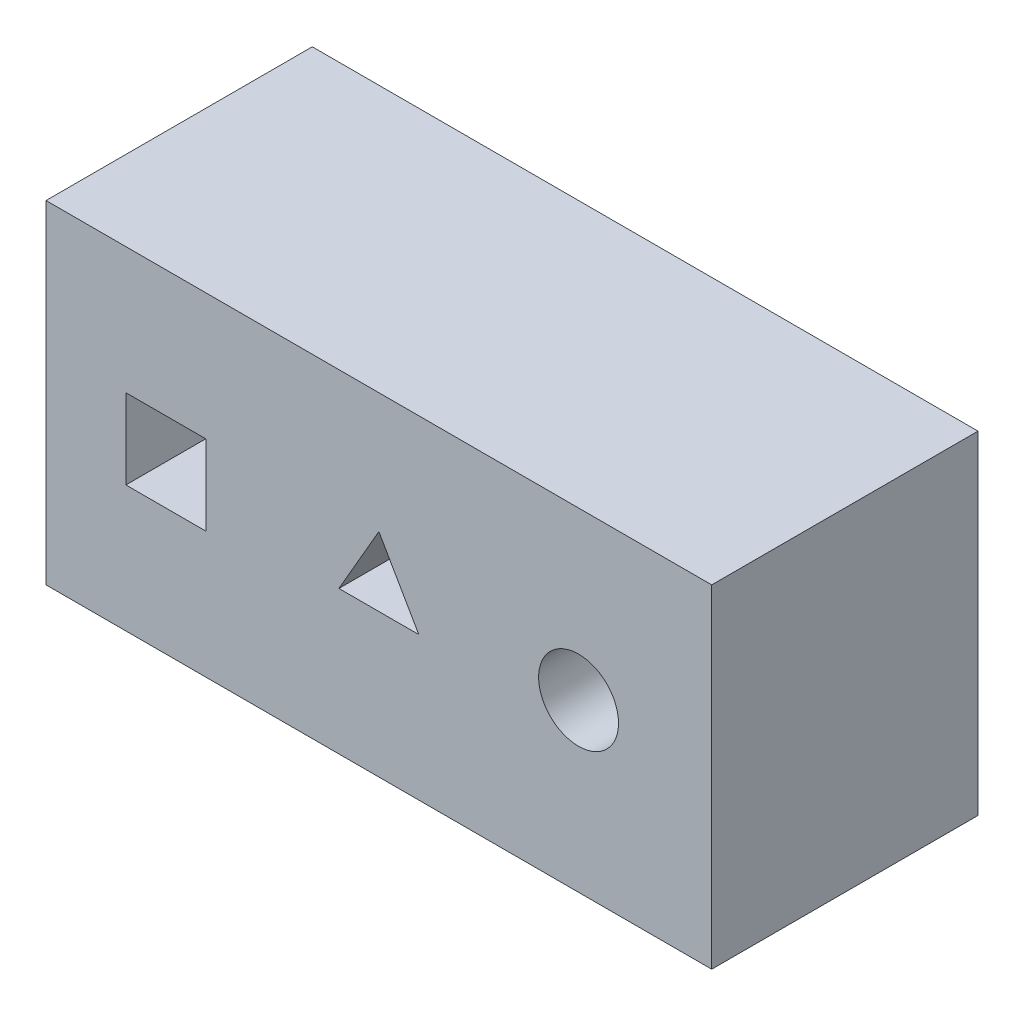
ISO-10303-21;
HEADER;
FILE_DESCRIPTION(('STEP AP214'),'2;1');
FILE_NAME('part.step','',(''),(''),'','','');
FILE_SCHEMA(('AUTOMOTIVE_DESIGN { 1 0 10303 214 1 1 1 1 }'));
ENDSEC;
DATA;
#1=APPLICATION_CONTEXT('core data for automotive mechanical design processes');
#2=APPLICATION_PROTOCOL_DEFINITION('international standard','automotive_design',2000,#1);
#3=PRODUCT_CONTEXT('',#1,'mechanical');
#4=PRODUCT('Part','Part','',(#3));
#5=PRODUCT_RELATED_PRODUCT_CATEGORY('part','',(#4));
#6=PRODUCT_DEFINITION_FORMATION('','',#4);
#7=PRODUCT_DEFINITION_CONTEXT('part definition',#1,'design');
#8=PRODUCT_DEFINITION('design','',#6,#7);
#9=PRODUCT_DEFINITION_SHAPE('','',#8);
#10=(LENGTH_UNIT() NAMED_UNIT(*) SI_UNIT(.MILLI.,.METRE.));
#11=(NAMED_UNIT(*) PLANE_ANGLE_UNIT() SI_UNIT($,.RADIAN.));
#12=(NAMED_UNIT(*) SI_UNIT($,.STERADIAN.) SOLID_ANGLE_UNIT());
#13=UNCERTAINTY_MEASURE_WITH_UNIT(LENGTH_MEASURE(1.E-05),#10,'distance_accuracy_value','');
#14=(GEOMETRIC_REPRESENTATION_CONTEXT(3) GLOBAL_UNCERTAINTY_ASSIGNED_CONTEXT((#13)) GLOBAL_UNIT_ASSIGNED_CONTEXT((#10,
#11,#12)) REPRESENTATION_CONTEXT('',''));
#15=CARTESIAN_POINT('',(0.,0.,0.));
#16=DIRECTION('',(0.,0.,1.));
#17=DIRECTION('',(1.,0.,0.));
#18=AXIS2_PLACEMENT_3D('',#15,#16,#17);
#19=CARTESIAN_POINT('',(0.,0.,100.));
#20=DIRECTION('',(0.,0.,1.));
#21=DIRECTION('',(1.,0.,0.));
#22=AXIS2_PLACEMENT_3D('',#19,#20,#21);
#23=PLANE('',#22);
#24=DIRECTION('',(0.,-1.,0.));
#25=VECTOR('',#24,1.);
#26=CARTESIAN_POINT('',(-125.,-62.5,100.));
#27=LINE('',#26,#25);
#28=CARTESIAN_POINT('',(-125.,62.5,100.));
#29=VERTEX_POINT('',#28);
#30=CARTESIAN_POINT('',(-125.,-62.5,100.));
#31=VERTEX_POINT('',#30);
#32=EDGE_CURVE('E204',#29,#31,#27,.T.);
#33=ORIENTED_EDGE('',*,*,#32,.T.);
#34=DIRECTION('',(1.,0.,0.));
#35=VECTOR('',#34,1.);
#36=CARTESIAN_POINT('',(125.,-62.5,100.));
#37=LINE('',#36,#35);
#38=CARTESIAN_POINT('',(125.,-62.5,100.));
#39=VERTEX_POINT('',#38);
#40=EDGE_CURVE('E92',#31,#39,#37,.T.);
#41=ORIENTED_EDGE('',*,*,#40,.T.);
#42=DIRECTION('',(0.,1.,0.));
#43=VECTOR('',#42,1.);
#44=CARTESIAN_POINT('',(125.,-62.5,100.));
#45=LINE('',#44,#43);
#46=CARTESIAN_POINT('',(125.,62.5,100.));
#47=VERTEX_POINT('',#46);
#48=EDGE_CURVE('E209',#39,#47,#45,.T.);
#49=ORIENTED_EDGE('',*,*,#48,.T.);
#50=DIRECTION('',(-1.,0.,0.));
#51=VECTOR('',#50,1.);
#52=CARTESIAN_POINT('',(125.,62.5,100.));
#53=LINE('',#52,#51);
#54=EDGE_CURVE('E61',#47,#29,#53,.T.);
#55=ORIENTED_EDGE('',*,*,#54,.T.);
#56=EDGE_LOOP('',(#33,#41,#49,#55));
#57=FACE_BOUND('',#56,.T.);
#58=CARTESIAN_POINT('',(74.9999999999999,0.,100.));
#59=DIRECTION('',(0.,0.,1.));
#60=DIRECTION('',(1.,0.,0.));
#61=AXIS2_PLACEMENT_3D('',#58,#59,#60);
#62=CIRCLE('',#61,15.);
#63=CARTESIAN_POINT('',(89.9999999999999,0.,100.));
#64=VERTEX_POINT('',#63);
#65=EDGE_CURVE('E305',#64,#64,#62,.T.);
#66=ORIENTED_EDGE('',*,*,#65,.F.);
#67=EDGE_LOOP('',(#66));
#68=FACE_BOUND('',#67,.T.);
#69=DIRECTION('',(1.,0.,0.));
#70=VECTOR('',#69,1.);
#71=CARTESIAN_POINT('',(0.,15.,100.));
#72=LINE('',#71,#70);
#73=CARTESIAN_POINT('',(-95.,15.,100.));
#74=VERTEX_POINT('',#73);
#75=CARTESIAN_POINT('',(-65.,15.,100.));
#76=VERTEX_POINT('',#75);
#77=EDGE_CURVE('E293',#74,#76,#72,.T.);
#78=ORIENTED_EDGE('',*,*,#77,.T.);
#79=DIRECTION('',(0.,-1.,0.));
#80=VECTOR('',#79,1.);
#81=CARTESIAN_POINT('',(-65.,0.,100.));
#82=LINE('',#81,#80);
#83=CARTESIAN_POINT('',(-65.,-15.,100.));
#84=VERTEX_POINT('',#83);
#85=EDGE_CURVE('E289',#76,#84,#82,.T.);
#86=ORIENTED_EDGE('',*,*,#85,.T.);
#87=DIRECTION('',(1.,0.,0.));
#88=VECTOR('',#87,1.);
#89=CARTESIAN_POINT('',(0.,-15.,100.));
#90=LINE('',#89,#88);
#91=CARTESIAN_POINT('',(-95.,-15.,100.));
#92=VERTEX_POINT('',#91);
#93=EDGE_CURVE('E177',#92,#84,#90,.T.);
#94=ORIENTED_EDGE('',*,*,#93,.F.);
#95=DIRECTION('',(0.,-1.,0.));
#96=VECTOR('',#95,1.);
#97=CARTESIAN_POINT('',(-95.,0.,100.));
#98=LINE('',#97,#96);
#99=EDGE_CURVE('E182',#74,#92,#98,.T.);
#100=ORIENTED_EDGE('',*,*,#99,.F.);
#101=EDGE_LOOP('',(#78,#86,#94,#100));
#102=FACE_BOUND('',#101,.T.);
#103=DIRECTION('',(0.5,-0.866025403784439,0.));
#104=VECTOR('',#103,1.);
#105=CARTESIAN_POINT('',(7.5,4.3301270189222,100.));
#106=LINE('',#105,#104);
#107=CARTESIAN_POINT('',(0.,17.3205080756888,100.));
#108=VERTEX_POINT('',#107);
#109=CARTESIAN_POINT('',(15.,-8.66025403784438,100.));
#110=VERTEX_POINT('',#109);
#111=EDGE_CURVE('E160',#108,#110,#106,.T.);
#112=ORIENTED_EDGE('',*,*,#111,.T.);
#113=DIRECTION('',(-1.,0.,0.));
#114=VECTOR('',#113,1.);
#115=CARTESIAN_POINT('',(0.,-8.66025403784438,100.));
#116=LINE('',#115,#114);
#117=CARTESIAN_POINT('',(-15.,-8.66025403784438,100.));
#118=VERTEX_POINT('',#117);
#119=EDGE_CURVE('E284',#110,#118,#116,.T.);
#120=ORIENTED_EDGE('',*,*,#119,.T.);
#121=DIRECTION('',(0.5,0.866025403784439,0.));
#122=VECTOR('',#121,1.);
#123=CARTESIAN_POINT('',(-7.5,4.33012701892219,100.));
#124=LINE('',#123,#122);
#125=EDGE_CURVE('E148',#118,#108,#124,.T.);
#126=ORIENTED_EDGE('',*,*,#125,.T.);
#127=EDGE_LOOP('',(#112,#120,#126));
#128=FACE_BOUND('',#127,.T.);
#129=ADVANCED_FACE('F43',(#57,#68,#102,#128),#23,.T.);
#130=CARTESIAN_POINT('',(0.,0.,0.));
#131=DIRECTION('',(0.,0.,1.));
#132=DIRECTION('',(1.,0.,0.));
#133=AXIS2_PLACEMENT_3D('',#130,#131,#132);
#134=PLANE('',#133);
#135=DIRECTION('',(0.,-1.,0.));
#136=VECTOR('',#135,1.);
#137=CARTESIAN_POINT('',(-125.,-62.5,0.));
#138=LINE('',#137,#136);
#139=CARTESIAN_POINT('',(-125.,62.5,0.));
#140=VERTEX_POINT('',#139);
#141=CARTESIAN_POINT('',(-125.,-62.5,0.));
#142=VERTEX_POINT('',#141);
#143=EDGE_CURVE('E203',#140,#142,#138,.T.);
#144=ORIENTED_EDGE('',*,*,#143,.F.);
#145=DIRECTION('',(-1.,0.,0.));
#146=VECTOR('',#145,1.);
#147=CARTESIAN_POINT('',(125.,62.5,0.));
#148=LINE('',#147,#146);
#149=CARTESIAN_POINT('',(125.,62.5,0.));
#150=VERTEX_POINT('',#149);
#151=EDGE_CURVE('E85',#150,#140,#148,.T.);
#152=ORIENTED_EDGE('',*,*,#151,.F.);
#153=DIRECTION('',(0.,1.,0.));
#154=VECTOR('',#153,1.);
#155=CARTESIAN_POINT('',(125.,-62.5,0.));
#156=LINE('',#155,#154);
#157=CARTESIAN_POINT('',(125.,-62.5,0.));
#158=VERTEX_POINT('',#157);
#159=EDGE_CURVE('E79',#158,#150,#156,.T.);
#160=ORIENTED_EDGE('',*,*,#159,.F.);
#161=DIRECTION('',(1.,0.,0.));
#162=VECTOR('',#161,1.);
#163=CARTESIAN_POINT('',(125.,-62.5,0.));
#164=LINE('',#163,#162);
#165=EDGE_CURVE('E218',#142,#158,#164,.T.);
#166=ORIENTED_EDGE('',*,*,#165,.F.);
#167=EDGE_LOOP('',(#144,#152,#160,#166));
#168=FACE_BOUND('',#167,.T.);
#169=DIRECTION('',(-0.5,0.866025403784439,0.));
#170=VECTOR('',#169,1.);
#171=CARTESIAN_POINT('',(7.5,4.3301270189222,0.));
#172=LINE('',#171,#170);
#173=CARTESIAN_POINT('',(15.,-8.66025403784438,0.));
#174=VERTEX_POINT('',#173);
#175=CARTESIAN_POINT('',(0.,17.3205080756888,0.));
#176=VERTEX_POINT('',#175);
#177=EDGE_CURVE('E136',#174,#176,#172,.T.);
#178=ORIENTED_EDGE('',*,*,#177,.T.);
#179=DIRECTION('',(-0.5,-0.866025403784439,0.));
#180=VECTOR('',#179,1.);
#181=CARTESIAN_POINT('',(-7.5,4.33012701892219,0.));
#182=LINE('',#181,#180);
#183=CARTESIAN_POINT('',(-15.,-8.66025403784438,-1.11022302462516E-13));
#184=VERTEX_POINT('',#183);
#185=EDGE_CURVE('E140',#176,#184,#182,.T.);
#186=ORIENTED_EDGE('',*,*,#185,.T.);
#187=DIRECTION('',(1.,0.,0.));
#188=VECTOR('',#187,1.);
#189=CARTESIAN_POINT('',(0.,-8.66025403784438,0.));
#190=LINE('',#189,#188);
#191=EDGE_CURVE('E143',#184,#174,#190,.T.);
#192=ORIENTED_EDGE('',*,*,#191,.T.);
#193=EDGE_LOOP('',(#178,#186,#192));
#194=FACE_BOUND('',#193,.T.);
#195=DIRECTION('',(-1.,0.,0.));
#196=VECTOR('',#195,1.);
#197=CARTESIAN_POINT('',(0.,15.,0.));
#198=LINE('',#197,#196);
#199=CARTESIAN_POINT('',(-65.,15.,0.));
#200=VERTEX_POINT('',#199);
#201=CARTESIAN_POINT('',(-95.,15.,0.));
#202=VERTEX_POINT('',#201);
#203=EDGE_CURVE('E191',#200,#202,#198,.T.);
#204=ORIENTED_EDGE('',*,*,#203,.T.);
#205=DIRECTION('',(0.,1.,0.));
#206=VECTOR('',#205,1.);
#207=CARTESIAN_POINT('',(-95.,0.,0.));
#208=LINE('',#207,#206);
#209=CARTESIAN_POINT('',(-95.,-15.,0.));
#210=VERTEX_POINT('',#209);
#211=EDGE_CURVE('E168',#210,#202,#208,.T.);
#212=ORIENTED_EDGE('',*,*,#211,.F.);
#213=DIRECTION('',(-1.,0.,0.));
#214=VECTOR('',#213,1.);
#215=CARTESIAN_POINT('',(0.,-15.,0.));
#216=LINE('',#215,#214);
#217=CARTESIAN_POINT('',(-65.,-15.,-1.11022302462516E-13));
#218=VERTEX_POINT('',#217);
#219=EDGE_CURVE('E186',#218,#210,#216,.T.);
#220=ORIENTED_EDGE('',*,*,#219,.F.);
#221=DIRECTION('',(0.,1.,0.));
#222=VECTOR('',#221,1.);
#223=CARTESIAN_POINT('',(-65.,0.,0.));
#224=LINE('',#223,#222);
#225=EDGE_CURVE('E194',#218,#200,#224,.T.);
#226=ORIENTED_EDGE('',*,*,#225,.T.);
#227=EDGE_LOOP('',(#204,#212,#220,#226));
#228=FACE_BOUND('',#227,.T.);
#229=CARTESIAN_POINT('',(74.9999999999999,0.,0.));
#230=DIRECTION('',(0.,0.,1.));
#231=DIRECTION('',(1.,0.,0.));
#232=AXIS2_PLACEMENT_3D('',#229,#230,#231);
#233=CIRCLE('',#232,15.);
#234=CARTESIAN_POINT('',(89.9999999999999,0.,0.));
#235=VERTEX_POINT('',#234);
#236=EDGE_CURVE('E173',#235,#235,#233,.F.);
#237=ORIENTED_EDGE('',*,*,#236,.F.);
#238=EDGE_LOOP('',(#237));
#239=FACE_BOUND('',#238,.T.);
#240=ADVANCED_FACE('F138',(#168,#194,#228,#239),#134,.F.);
#241=CARTESIAN_POINT('',(-125.,-62.5,100.));
#242=DIRECTION('',(1.,0.,0.));
#243=DIRECTION('',(0.,0.,-1.));
#244=AXIS2_PLACEMENT_3D('',#241,#242,#243);
#245=PLANE('',#244);
#246=ORIENTED_EDGE('',*,*,#143,.T.);
#247=DIRECTION('',(0.,0.,-1.));
#248=VECTOR('',#247,1.);
#249=CARTESIAN_POINT('',(-125.,-62.5,100.));
#250=LINE('',#249,#248);
#251=EDGE_CURVE('E11',#31,#142,#250,.T.);
#252=ORIENTED_EDGE('',*,*,#251,.F.);
#253=ORIENTED_EDGE('',*,*,#32,.F.);
#254=DIRECTION('',(0.,0.,-1.));
#255=VECTOR('',#254,1.);
#256=CARTESIAN_POINT('',(-125.,62.5,100.));
#257=LINE('',#256,#255);
#258=EDGE_CURVE('E214',#29,#140,#257,.T.);
#259=ORIENTED_EDGE('',*,*,#258,.T.);
#260=EDGE_LOOP('',(#246,#252,#253,#259));
#261=FACE_BOUND('',#260,.T.);
#262=ADVANCED_FACE('F45',(#261),#245,.F.);
#263=CARTESIAN_POINT('',(125.,-62.5,100.));
#264=DIRECTION('',(0.,1.,0.));
#265=DIRECTION('',(-1.,0.,0.));
#266=AXIS2_PLACEMENT_3D('',#263,#264,#265);
#267=PLANE('',#266);
#268=ORIENTED_EDGE('',*,*,#165,.T.);
#269=DIRECTION('',(0.,0.,-1.));
#270=VECTOR('',#269,1.);
#271=CARTESIAN_POINT('',(125.,-62.5,100.));
#272=LINE('',#271,#270);
#273=EDGE_CURVE('E53',#39,#158,#272,.T.);
#274=ORIENTED_EDGE('',*,*,#273,.F.);
#275=ORIENTED_EDGE('',*,*,#40,.F.);
#276=ORIENTED_EDGE('',*,*,#251,.T.);
#277=EDGE_LOOP('',(#268,#274,#275,#276));
#278=FACE_BOUND('',#277,.T.);
#279=ADVANCED_FACE('F245',(#278),#267,.F.);
#280=CARTESIAN_POINT('',(125.,-62.5,100.));
#281=DIRECTION('',(-1.,0.,0.));
#282=DIRECTION('',(0.,0.,1.));
#283=AXIS2_PLACEMENT_3D('',#280,#281,#282);
#284=PLANE('',#283);
#285=ORIENTED_EDGE('',*,*,#159,.T.);
#286=DIRECTION('',(0.,0.,-1.));
#287=VECTOR('',#286,1.);
#288=CARTESIAN_POINT('',(125.,62.5,100.));
#289=LINE('',#288,#287);
#290=EDGE_CURVE('E227',#47,#150,#289,.T.);
#291=ORIENTED_EDGE('',*,*,#290,.F.);
#292=ORIENTED_EDGE('',*,*,#48,.F.);
#293=ORIENTED_EDGE('',*,*,#273,.T.);
#294=EDGE_LOOP('',(#285,#291,#292,#293));
#295=FACE_BOUND('',#294,.T.);
#296=ADVANCED_FACE('F231',(#295),#284,.F.);
#297=CARTESIAN_POINT('',(125.,62.5,100.));
#298=DIRECTION('',(0.,-1.,0.));
#299=DIRECTION('',(1.,0.,0.));
#300=AXIS2_PLACEMENT_3D('',#297,#298,#299);
#301=PLANE('',#300);
#302=ORIENTED_EDGE('',*,*,#151,.T.);
#303=ORIENTED_EDGE('',*,*,#258,.F.);
#304=ORIENTED_EDGE('',*,*,#54,.F.);
#305=ORIENTED_EDGE('',*,*,#290,.T.);
#306=EDGE_LOOP('',(#302,#303,#304,#305));
#307=FACE_BOUND('',#306,.T.);
#308=ADVANCED_FACE('F237',(#307),#301,.F.);
#309=CARTESIAN_POINT('',(7.5,4.3301270189222,-279.508497187474));
#310=DIRECTION('',(-0.866025403784439,-0.5,0.));
#311=DIRECTION('',(0.5,-0.866025403784439,0.));
#312=AXIS2_PLACEMENT_3D('',#309,#310,#311);
#313=PLANE('',#312);
#314=ORIENTED_EDGE('',*,*,#177,.F.);
#315=DIRECTION('',(0.,0.,1.));
#316=VECTOR('',#315,1.);
#317=CARTESIAN_POINT('',(15.,-8.66025403784438,-279.508497187474));
#318=LINE('',#317,#316);
#319=EDGE_CURVE('E164',#174,#110,#318,.T.);
#320=ORIENTED_EDGE('',*,*,#319,.T.);
#321=ORIENTED_EDGE('',*,*,#111,.F.);
#322=DIRECTION('',(0.,0.,1.));
#323=VECTOR('',#322,1.);
#324=CARTESIAN_POINT('',(0.,17.3205080756888,-279.508497187474));
#325=LINE('',#324,#323);
#326=EDGE_CURVE('E153',#176,#108,#325,.T.);
#327=ORIENTED_EDGE('',*,*,#326,.F.);
#328=EDGE_LOOP('',(#314,#320,#321,#327));
#329=FACE_BOUND('',#328,.T.);
#330=ADVANCED_FACE('F158',(#329),#313,.T.);
#331=CARTESIAN_POINT('',(-7.5,4.33012701892219,-279.508497187474));
#332=DIRECTION('',(0.866025403784439,-0.5,0.));
#333=DIRECTION('',(0.5,0.866025403784439,0.));
#334=AXIS2_PLACEMENT_3D('',#331,#332,#333);
#335=PLANE('',#334);
#336=ORIENTED_EDGE('',*,*,#185,.F.);
#337=ORIENTED_EDGE('',*,*,#326,.T.);
#338=ORIENTED_EDGE('',*,*,#125,.F.);
#339=DIRECTION('',(0.,0.,1.));
#340=VECTOR('',#339,1.);
#341=CARTESIAN_POINT('',(-15.,-8.66025403784438,-279.508497187474));
#342=LINE('',#341,#340);
#343=EDGE_CURVE('E155',#184,#118,#342,.T.);
#344=ORIENTED_EDGE('',*,*,#343,.F.);
#345=EDGE_LOOP('',(#336,#337,#338,#344));
#346=FACE_BOUND('',#345,.T.);
#347=ADVANCED_FACE('F151',(#346),#335,.T.);
#348=CARTESIAN_POINT('',(0.,15.,-279.508497187474));
#349=DIRECTION('',(0.,-1.,0.));
#350=DIRECTION('',(0.,0.,-1.));
#351=AXIS2_PLACEMENT_3D('',#348,#349,#350);
#352=PLANE('',#351);
#353=ORIENTED_EDGE('',*,*,#203,.F.);
#354=DIRECTION('',(0.,0.,1.));
#355=VECTOR('',#354,1.);
#356=CARTESIAN_POINT('',(-65.,15.,-279.508497187474));
#357=LINE('',#356,#355);
#358=EDGE_CURVE('E163',#200,#76,#357,.T.);
#359=ORIENTED_EDGE('',*,*,#358,.T.);
#360=ORIENTED_EDGE('',*,*,#77,.F.);
#361=DIRECTION('',(0.,0.,1.));
#362=VECTOR('',#361,1.);
#363=CARTESIAN_POINT('',(-95.,15.,-279.508497187474));
#364=LINE('',#363,#362);
#365=EDGE_CURVE('E179',#202,#74,#364,.T.);
#366=ORIENTED_EDGE('',*,*,#365,.F.);
#367=EDGE_LOOP('',(#353,#359,#360,#366));
#368=FACE_BOUND('',#367,.T.);
#369=ADVANCED_FACE('F260',(#368),#352,.T.);
#370=CARTESIAN_POINT('',(-95.,0.,-279.508497187474));
#371=DIRECTION('',(-1.,0.,0.));
#372=DIRECTION('',(0.,0.,1.));
#373=AXIS2_PLACEMENT_3D('',#370,#371,#372);
#374=PLANE('',#373);
#375=DIRECTION('',(0.,0.,1.));
#376=VECTOR('',#375,1.);
#377=CARTESIAN_POINT('',(-95.,-15.,-279.508497187474));
#378=LINE('',#377,#376);
#379=EDGE_CURVE('E183',#210,#92,#378,.T.);
#380=ORIENTED_EDGE('',*,*,#379,.F.);
#381=ORIENTED_EDGE('',*,*,#211,.T.);
#382=ORIENTED_EDGE('',*,*,#365,.T.);
#383=ORIENTED_EDGE('',*,*,#99,.T.);
#384=EDGE_LOOP('',(#380,#381,#382,#383));
#385=FACE_BOUND('',#384,.T.);
#386=ADVANCED_FACE('F263',(#385),#374,.F.);
#387=CARTESIAN_POINT('',(0.,-15.,-279.508497187474));
#388=DIRECTION('',(0.,-1.,0.));
#389=DIRECTION('',(0.,0.,-1.));
#390=AXIS2_PLACEMENT_3D('',#387,#388,#389);
#391=PLANE('',#390);
#392=DIRECTION('',(0.,0.,1.));
#393=VECTOR('',#392,1.);
#394=CARTESIAN_POINT('',(-65.,-15.,-279.508497187474));
#395=LINE('',#394,#393);
#396=EDGE_CURVE('E176',#218,#84,#395,.T.);
#397=ORIENTED_EDGE('',*,*,#396,.F.);
#398=ORIENTED_EDGE('',*,*,#219,.T.);
#399=ORIENTED_EDGE('',*,*,#379,.T.);
#400=ORIENTED_EDGE('',*,*,#93,.T.);
#401=EDGE_LOOP('',(#397,#398,#399,#400));
#402=FACE_BOUND('',#401,.T.);
#403=ADVANCED_FACE('F267',(#402),#391,.F.);
#404=CARTESIAN_POINT('',(0.,-8.66025403784438,-279.508497187474));
#405=DIRECTION('',(0.,1.,0.));
#406=DIRECTION('',(-1.,0.,0.));
#407=AXIS2_PLACEMENT_3D('',#404,#405,#406);
#408=PLANE('',#407);
#409=ORIENTED_EDGE('',*,*,#191,.F.);
#410=ORIENTED_EDGE('',*,*,#343,.T.);
#411=ORIENTED_EDGE('',*,*,#119,.F.);
#412=ORIENTED_EDGE('',*,*,#319,.F.);
#413=EDGE_LOOP('',(#409,#410,#411,#412));
#414=FACE_BOUND('',#413,.T.);
#415=ADVANCED_FACE('F271',(#414),#408,.T.);
#416=CARTESIAN_POINT('',(-65.,0.,-279.508497187474));
#417=DIRECTION('',(-1.,0.,0.));
#418=DIRECTION('',(0.,0.,1.));
#419=AXIS2_PLACEMENT_3D('',#416,#417,#418);
#420=PLANE('',#419);
#421=ORIENTED_EDGE('',*,*,#225,.F.);
#422=ORIENTED_EDGE('',*,*,#396,.T.);
#423=ORIENTED_EDGE('',*,*,#85,.F.);
#424=ORIENTED_EDGE('',*,*,#358,.F.);
#425=EDGE_LOOP('',(#421,#422,#423,#424));
#426=FACE_BOUND('',#425,.T.);
#427=ADVANCED_FACE('F258',(#426),#420,.T.);
#428=CARTESIAN_POINT('',(74.9999999999999,0.,-279.508497187474));
#429=DIRECTION('',(0.,0.,1.));
#430=DIRECTION('',(1.,0.,0.));
#431=AXIS2_PLACEMENT_3D('',#428,#429,#430);
#432=CYLINDRICAL_SURFACE('',#431,15.);
#433=CARTESIAN_POINT('',(89.9999999999999,0.,0.));
#434=CARTESIAN_POINT('',(89.9999999999999,0.,1.04166666666661));
#435=CARTESIAN_POINT('',(89.9999999999999,0.,2.08333333333327));
#436=CARTESIAN_POINT('',(89.9999999999999,0.,4.1666666666666));
#437=CARTESIAN_POINT('',(89.9999999999999,0.,5.20833333333326));
#438=CARTESIAN_POINT('',(89.9999999999999,0.,7.2916666666666));
#439=CARTESIAN_POINT('',(89.9999999999999,0.,8.33333333333329));
#440=CARTESIAN_POINT('',(89.9999999999999,0.,10.4166666666666));
#441=CARTESIAN_POINT('',(89.9999999999999,0.,11.4583333333333));
#442=CARTESIAN_POINT('',(89.9999999999999,0.,13.5416666666666));
#443=CARTESIAN_POINT('',(89.9999999999999,0.,14.5833333333333));
#444=CARTESIAN_POINT('',(89.9999999999999,0.,16.6666666666666));
#445=CARTESIAN_POINT('',(89.9999999999999,0.,17.7083333333333));
#446=CARTESIAN_POINT('',(89.9999999999999,0.,19.7916666666667));
#447=CARTESIAN_POINT('',(89.9999999999999,0.,20.8333333333333));
#448=CARTESIAN_POINT('',(89.9999999999999,0.,22.9166666666666));
#449=CARTESIAN_POINT('',(89.9999999999999,0.,23.9583333333333));
#450=CARTESIAN_POINT('',(89.9999999999999,0.,26.0416666666666));
#451=CARTESIAN_POINT('',(89.9999999999999,0.,27.0833333333333));
#452=CARTESIAN_POINT('',(89.9999999999999,0.,29.1666666666666));
#453=CARTESIAN_POINT('',(89.9999999999999,0.,30.2083333333333));
#454=CARTESIAN_POINT('',(89.9999999999999,0.,32.2916666666666));
#455=CARTESIAN_POINT('',(89.9999999999999,0.,33.3333333333333));
#456=CARTESIAN_POINT('',(89.9999999999999,0.,35.4166666666667));
#457=CARTESIAN_POINT('',(89.9999999999999,0.,36.4583333333333));
#458=CARTESIAN_POINT('',(89.9999999999999,0.,38.5416666666666));
#459=CARTESIAN_POINT('',(89.9999999999999,0.,39.5833333333333));
#460=CARTESIAN_POINT('',(89.9999999999999,0.,41.6666666666667));
#461=CARTESIAN_POINT('',(89.9999999999999,0.,42.7083333333333));
#462=CARTESIAN_POINT('',(89.9999999999999,0.,44.7916666666667));
#463=CARTESIAN_POINT('',(89.9999999999999,0.,45.8333333333333));
#464=CARTESIAN_POINT('',(89.9999999999999,0.,47.9166666666667));
#465=CARTESIAN_POINT('',(89.9999999999999,0.,48.9583333333333));
#466=CARTESIAN_POINT('',(89.9999999999999,0.,51.0416666666667));
#467=CARTESIAN_POINT('',(89.9999999999999,0.,52.0833333333333));
#468=CARTESIAN_POINT('',(89.9999999999999,0.,54.1666666666666));
#469=CARTESIAN_POINT('',(89.9999999999999,0.,55.2083333333333));
#470=CARTESIAN_POINT('',(89.9999999999999,0.,57.2916666666667));
#471=CARTESIAN_POINT('',(89.9999999999999,0.,58.3333333333333));
#472=CARTESIAN_POINT('',(89.9999999999999,0.,60.4166666666667));
#473=CARTESIAN_POINT('',(89.9999999999999,0.,61.4583333333333));
#474=CARTESIAN_POINT('',(89.9999999999999,0.,63.5416666666667));
#475=CARTESIAN_POINT('',(89.9999999999999,0.,64.5833333333333));
#476=CARTESIAN_POINT('',(89.9999999999999,0.,66.6666666666667));
#477=CARTESIAN_POINT('',(89.9999999999999,0.,67.7083333333334));
#478=CARTESIAN_POINT('',(89.9999999999999,0.,69.7916666666667));
#479=CARTESIAN_POINT('',(89.9999999999999,0.,70.8333333333334));
#480=CARTESIAN_POINT('',(89.9999999999999,0.,72.9166666666667));
#481=CARTESIAN_POINT('',(89.9999999999999,0.,73.9583333333333));
#482=CARTESIAN_POINT('',(89.9999999999999,0.,76.0416666666667));
#483=CARTESIAN_POINT('',(89.9999999999999,0.,77.0833333333333));
#484=CARTESIAN_POINT('',(89.9999999999999,0.,79.1666666666667));
#485=CARTESIAN_POINT('',(89.9999999999999,0.,80.2083333333333));
#486=CARTESIAN_POINT('',(89.9999999999999,0.,82.2916666666667));
#487=CARTESIAN_POINT('',(89.9999999999999,0.,83.3333333333334));
#488=CARTESIAN_POINT('',(89.9999999999999,0.,85.4166666666667));
#489=CARTESIAN_POINT('',(89.9999999999999,0.,86.4583333333334));
#490=CARTESIAN_POINT('',(89.9999999999999,0.,88.5416666666667));
#491=CARTESIAN_POINT('',(89.9999999999999,0.,89.5833333333333));
#492=CARTESIAN_POINT('',(89.9999999999999,0.,91.6666666666667));
#493=CARTESIAN_POINT('',(89.9999999999999,0.,92.7083333333334));
#494=CARTESIAN_POINT('',(89.9999999999999,0.,94.7916666666667));
#495=CARTESIAN_POINT('',(89.9999999999999,0.,95.8333333333334));
#496=CARTESIAN_POINT('',(89.9999999999999,0.,97.9166666666667));
#497=CARTESIAN_POINT('',(89.9999999999999,0.,98.9583333333334));
#498=CARTESIAN_POINT('',(89.9999999999999,0.,100.));
#499=B_SPLINE_CURVE_WITH_KNOTS('',3,(#433,#434,#435,#436,#437,#438,#439,#440,#441,#442,#443,
#444,#445,#446,#447,#448,#449,#450,#451,#452,#453,#454,#455,#456,#457,#458,#459,#460,#461,#462,
#463,#464,#465,#466,#467,#468,#469,#470,#471,#472,#473,#474,#475,#476,#477,#478,#479,#480,#481,
#482,#483,#484,#485,#486,#487,#488,#489,#490,#491,#492,#493,#494,#495,#496,#497,#498),
.UNSPECIFIED.,.F.,.F.,(4,2,2,2,2,2,2,2,2,2,2,2,2,2,2,2,2,2,2,2,2,2,2,2,2,2,2,2,2,2,2,2,4),(0.,
3.12499999999999,6.24999999999998,9.37500000000002,12.5,15.625,18.75,21.875,25.,28.125,31.25,
34.375,37.5,40.625,43.7500000000001,46.8750000000001,50.,53.125,56.25,59.3750000000001,
62.5000000000001,65.625,68.7500000000001,71.8750000000001,75.0000000000001,78.1250000000001,
81.25,84.3750000000001,87.5000000000001,90.6250000000001,93.7500000000001,96.8750000000001,
100.),.UNSPECIFIED.);
#500=EDGE_CURVE('BSEAM255',#235,#64,#499,.T.);
#501=ORIENTED_EDGE('',*,*,#236,.T.);
#502=ORIENTED_EDGE('',*,*,#65,.T.);
#503=ORIENTED_EDGE('',*,*,#500,.T.);
#504=ORIENTED_EDGE('',*,*,#500,.F.);
#505=EDGE_LOOP('',(#501,#503,#502,#504));
#506=FACE_BOUND('',#505,.T.);
#507=ADVANCED_FACE('F255',(#506),#432,.F.);
#508=CLOSED_SHELL('',(#129,#240,#262,#279,#296,#308,#330,#347,#369,#386,#403,#415,#427,#507));
#509=MANIFOLD_SOLID_BREP('B2',#508);
#510=ADVANCED_BREP_SHAPE_REPRESENTATION('',(#18,#509),#14);
#511=SHAPE_DEFINITION_REPRESENTATION(#9,#510);
ENDSEC;
END-ISO-10303-21;
